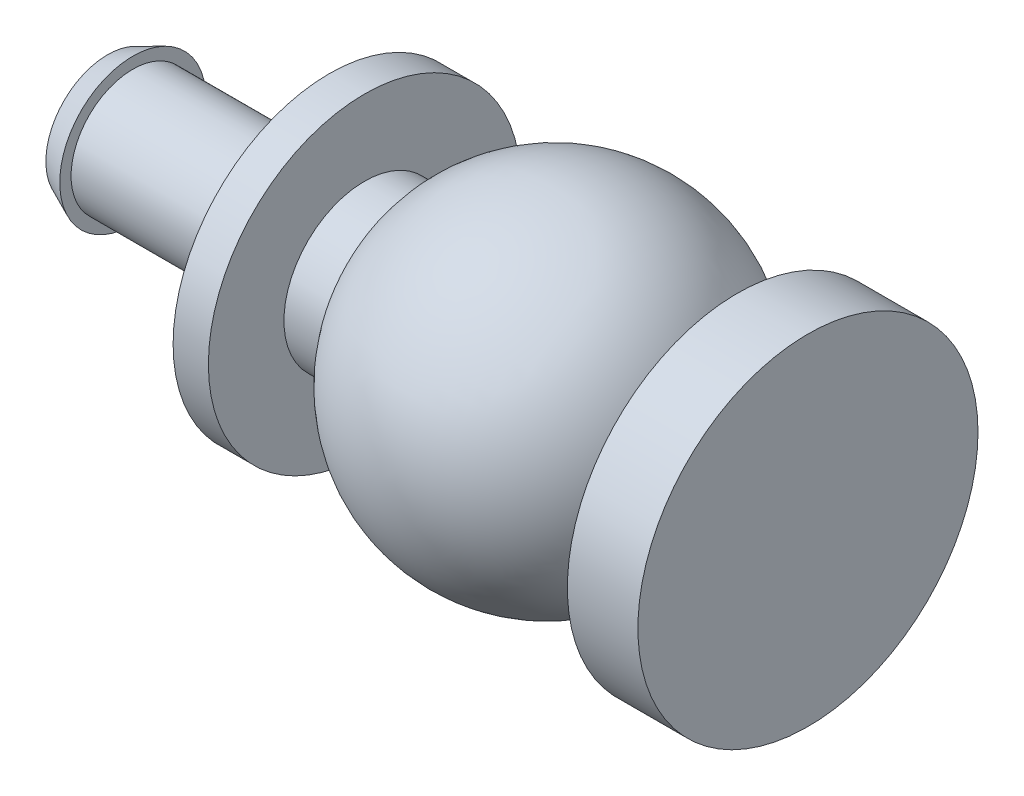
ISO-10303-21;
HEADER;
FILE_DESCRIPTION(('STEP AP214'),'2;1');
FILE_NAME('part.step','',(''),(''),'','','');
FILE_SCHEMA(('AUTOMOTIVE_DESIGN { 1 0 10303 214 1 1 1 1 }'));
ENDSEC;
DATA;
#1=APPLICATION_CONTEXT('core data for automotive mechanical design processes');
#2=APPLICATION_PROTOCOL_DEFINITION('international standard','automotive_design',2000,#1);
#3=PRODUCT_CONTEXT('',#1,'mechanical');
#4=PRODUCT('Part','Part','',(#3));
#5=PRODUCT_RELATED_PRODUCT_CATEGORY('part','',(#4));
#6=PRODUCT_DEFINITION_FORMATION('','',#4);
#7=PRODUCT_DEFINITION_CONTEXT('part definition',#1,'design');
#8=PRODUCT_DEFINITION('design','',#6,#7);
#9=PRODUCT_DEFINITION_SHAPE('','',#8);
#10=(LENGTH_UNIT() NAMED_UNIT(*) SI_UNIT(.MILLI.,.METRE.));
#11=(NAMED_UNIT(*) PLANE_ANGLE_UNIT() SI_UNIT($,.RADIAN.));
#12=(NAMED_UNIT(*) SI_UNIT($,.STERADIAN.) SOLID_ANGLE_UNIT());
#13=UNCERTAINTY_MEASURE_WITH_UNIT(LENGTH_MEASURE(1.E-05),#10,'distance_accuracy_value','');
#14=(GEOMETRIC_REPRESENTATION_CONTEXT(3) GLOBAL_UNCERTAINTY_ASSIGNED_CONTEXT((#13)) GLOBAL_UNIT_ASSIGNED_CONTEXT((#10,
#11,#12)) REPRESENTATION_CONTEXT('',''));
#15=CARTESIAN_POINT('',(0.,0.,0.));
#16=DIRECTION('',(0.,0.,1.));
#17=DIRECTION('',(1.,0.,0.));
#18=AXIS2_PLACEMENT_3D('',#15,#16,#17);
#19=CARTESIAN_POINT('',(0.,0.,0.));
#20=DIRECTION('',(1.,0.,0.));
#21=DIRECTION('',(0.,0.,-1.));
#22=AXIS2_PLACEMENT_3D('',#19,#20,#21);
#23=PLANE('',#22);
#24=CARTESIAN_POINT('',(0.,0.,0.));
#25=DIRECTION('',(-1.,0.,0.));
#26=DIRECTION('',(0.,0.,1.));
#27=AXIS2_PLACEMENT_3D('',#24,#25,#26);
#28=CIRCLE('',#27,1.25);
#29=CARTESIAN_POINT('',(0.,0.,1.25));
#30=VERTEX_POINT('',#29);
#31=EDGE_CURVE('E75',#30,#30,#28,.T.);
#32=ORIENTED_EDGE('',*,*,#31,.F.);
#33=EDGE_LOOP('',(#32));
#34=FACE_BOUND('',#33,.T.);
#35=CARTESIAN_POINT('',(0.,0.,0.));
#36=DIRECTION('',(1.,0.,0.));
#37=DIRECTION('',(0.,0.,-1.));
#38=AXIS2_PLACEMENT_3D('',#35,#36,#37);
#39=CIRCLE('',#38,2.45);
#40=CARTESIAN_POINT('',(0.,0.,-2.45));
#41=VERTEX_POINT('',#40);
#42=EDGE_CURVE('E10',#41,#41,#39,.T.);
#43=ORIENTED_EDGE('',*,*,#42,.F.);
#44=EDGE_LOOP('',(#43));
#45=FACE_BOUND('',#44,.T.);
#46=ADVANCED_FACE('F31',(#34,#45),#23,.F.);
#47=CARTESIAN_POINT('',(0.,0.,0.));
#48=DIRECTION('',(1.,0.,0.));
#49=DIRECTION('',(0.,0.,-1.));
#50=AXIS2_PLACEMENT_3D('',#47,#48,#49);
#51=CONICAL_SURFACE('',#50,2.45,0.422853926132942);
#52=CARTESIAN_POINT('',(1.,0.,0.));
#53=DIRECTION('',(1.,0.,0.));
#54=DIRECTION('',(0.,0.,-1.));
#55=AXIS2_PLACEMENT_3D('',#52,#53,#54);
#56=CIRCLE('',#55,2.9);
#57=CARTESIAN_POINT('',(1.,0.,-2.9));
#58=VERTEX_POINT('',#57);
#59=EDGE_CURVE('E37',#58,#58,#56,.T.);
#60=ORIENTED_EDGE('',*,*,#59,.F.);
#61=EDGE_LOOP('',(#60));
#62=FACE_BOUND('',#61,.T.);
#63=ORIENTED_EDGE('',*,*,#42,.T.);
#64=EDGE_LOOP('',(#63));
#65=FACE_BOUND('',#64,.T.);
#66=ADVANCED_FACE('F92',(#62,#65),#51,.T.);
#67=CARTESIAN_POINT('',(1.,0.,2.9));
#68=DIRECTION('',(-1.,0.,0.));
#69=DIRECTION('',(0.,0.,1.));
#70=AXIS2_PLACEMENT_3D('',#67,#68,#69);
#71=PLANE('',#70);
#72=CARTESIAN_POINT('',(1.,0.,0.));
#73=DIRECTION('',(1.,0.,0.));
#74=DIRECTION('',(0.,0.,-1.));
#75=AXIS2_PLACEMENT_3D('',#72,#73,#74);
#76=CIRCLE('',#75,2.45);
#77=CARTESIAN_POINT('',(1.,0.,-2.45));
#78=VERTEX_POINT('',#77);
#79=EDGE_CURVE('E41',#78,#78,#76,.T.);
#80=ORIENTED_EDGE('',*,*,#79,.F.);
#81=EDGE_LOOP('',(#80));
#82=FACE_BOUND('',#81,.T.);
#83=ORIENTED_EDGE('',*,*,#59,.T.);
#84=EDGE_LOOP('',(#83));
#85=FACE_BOUND('',#84,.T.);
#86=ADVANCED_FACE('F96',(#82,#85),#71,.F.);
#87=CARTESIAN_POINT('',(27.8,0.,0.));
#88=DIRECTION('',(1.,0.,0.));
#89=DIRECTION('',(0.,0.,-1.));
#90=AXIS2_PLACEMENT_3D('',#87,#88,#89);
#91=CYLINDRICAL_SURFACE('',#90,2.45);
#92=CARTESIAN_POINT('',(6.8,0.,0.));
#93=DIRECTION('',(1.,0.,0.));
#94=DIRECTION('',(0.,0.,-1.));
#95=AXIS2_PLACEMENT_3D('',#92,#93,#94);
#96=CIRCLE('',#95,2.45);
#97=CARTESIAN_POINT('',(6.8,0.,-2.45));
#98=VERTEX_POINT('',#97);
#99=EDGE_CURVE('E45',#98,#98,#96,.T.);
#100=ORIENTED_EDGE('',*,*,#99,.F.);
#101=EDGE_LOOP('',(#100));
#102=FACE_BOUND('',#101,.T.);
#103=ORIENTED_EDGE('',*,*,#79,.T.);
#104=EDGE_LOOP('',(#103));
#105=FACE_BOUND('',#104,.T.);
#106=ADVANCED_FACE('F101',(#102,#105),#91,.T.);
#107=CARTESIAN_POINT('',(6.8,0.,0.));
#108=DIRECTION('',(1.,0.,0.));
#109=DIRECTION('',(0.,0.,-1.));
#110=AXIS2_PLACEMENT_3D('',#107,#108,#109);
#111=CONICAL_SURFACE('',#110,2.45,1.08083900054117);
#112=CARTESIAN_POINT('',(8.8,0.,0.));
#113=DIRECTION('',(1.,0.,0.));
#114=DIRECTION('',(0.,0.,-1.));
#115=AXIS2_PLACEMENT_3D('',#112,#113,#114);
#116=CIRCLE('',#115,6.2);
#117=CARTESIAN_POINT('',(8.8,0.,-6.2));
#118=VERTEX_POINT('',#117);
#119=EDGE_CURVE('E50',#118,#118,#116,.T.);
#120=ORIENTED_EDGE('',*,*,#119,.F.);
#121=EDGE_LOOP('',(#120));
#122=FACE_BOUND('',#121,.T.);
#123=ORIENTED_EDGE('',*,*,#99,.T.);
#124=EDGE_LOOP('',(#123));
#125=FACE_BOUND('',#124,.T.);
#126=ADVANCED_FACE('F107',(#122,#125),#111,.T.);
#127=CARTESIAN_POINT('',(27.8,0.,0.));
#128=DIRECTION('',(1.,0.,0.));
#129=DIRECTION('',(0.,0.,-1.));
#130=AXIS2_PLACEMENT_3D('',#127,#128,#129);
#131=CYLINDRICAL_SURFACE('',#130,6.2);
#132=CARTESIAN_POINT('',(10.2,0.,0.));
#133=DIRECTION('',(1.,0.,0.));
#134=DIRECTION('',(0.,0.,-1.));
#135=AXIS2_PLACEMENT_3D('',#132,#133,#134);
#136=CIRCLE('',#135,6.2);
#137=CARTESIAN_POINT('',(10.2,0.,-6.2));
#138=VERTEX_POINT('',#137);
#139=EDGE_CURVE('E53',#138,#138,#136,.T.);
#140=ORIENTED_EDGE('',*,*,#139,.F.);
#141=EDGE_LOOP('',(#140));
#142=FACE_BOUND('',#141,.T.);
#143=ORIENTED_EDGE('',*,*,#119,.T.);
#144=EDGE_LOOP('',(#143));
#145=FACE_BOUND('',#144,.T.);
#146=ADVANCED_FACE('F111',(#142,#145),#131,.T.);
#147=CARTESIAN_POINT('',(10.2,0.,6.2));
#148=DIRECTION('',(-1.,0.,0.));
#149=DIRECTION('',(0.,0.,1.));
#150=AXIS2_PLACEMENT_3D('',#147,#148,#149);
#151=PLANE('',#150);
#152=CARTESIAN_POINT('',(10.2,0.,0.));
#153=DIRECTION('',(1.,0.,0.));
#154=DIRECTION('',(0.,0.,-1.));
#155=AXIS2_PLACEMENT_3D('',#152,#153,#154);
#156=CIRCLE('',#155,3.2);
#157=CARTESIAN_POINT('',(10.2,0.,-3.2));
#158=VERTEX_POINT('',#157);
#159=EDGE_CURVE('E56',#158,#158,#156,.T.);
#160=ORIENTED_EDGE('',*,*,#159,.F.);
#161=EDGE_LOOP('',(#160));
#162=FACE_BOUND('',#161,.T.);
#163=ORIENTED_EDGE('',*,*,#139,.T.);
#164=EDGE_LOOP('',(#163));
#165=FACE_BOUND('',#164,.T.);
#166=ADVANCED_FACE('F115',(#162,#165),#151,.F.);
#167=CARTESIAN_POINT('',(27.8,0.,0.));
#168=DIRECTION('',(1.,0.,0.));
#169=DIRECTION('',(0.,0.,-1.));
#170=AXIS2_PLACEMENT_3D('',#167,#168,#169);
#171=CYLINDRICAL_SURFACE('',#170,3.2);
#172=CARTESIAN_POINT('',(11.85,0.,0.));
#173=DIRECTION('',(1.,0.,0.));
#174=DIRECTION('',(0.,0.,-1.));
#175=AXIS2_PLACEMENT_3D('',#172,#173,#174);
#176=CIRCLE('',#175,3.2);
#177=CARTESIAN_POINT('',(11.85,0.,-3.2));
#178=VERTEX_POINT('',#177);
#179=EDGE_CURVE('E59',#178,#178,#176,.T.);
#180=ORIENTED_EDGE('',*,*,#179,.F.);
#181=EDGE_LOOP('',(#180));
#182=FACE_BOUND('',#181,.T.);
#183=ORIENTED_EDGE('',*,*,#159,.T.);
#184=EDGE_LOOP('',(#183));
#185=FACE_BOUND('',#184,.T.);
#186=ADVANCED_FACE('F119',(#182,#185),#171,.T.);
#187=CARTESIAN_POINT('',(17.6,0.,0.));
#188=DIRECTION('',(1.,0.,0.));
#189=DIRECTION('',(0.,0.,-1.));
#190=AXIS2_PLACEMENT_3D('',#187,#188,#189);
#191=DEGENERATE_TOROIDAL_SURFACE('',#190,0.318309859154926,6.43169014084507,.T.);
#192=CARTESIAN_POINT('',(23.35,0.,0.));
#193=DIRECTION('',(1.,0.,0.));
#194=DIRECTION('',(0.,0.,-1.));
#195=AXIS2_PLACEMENT_3D('',#192,#193,#194);
#196=CIRCLE('',#195,3.2);
#197=CARTESIAN_POINT('',(23.35,0.,-3.2));
#198=VERTEX_POINT('',#197);
#199=EDGE_CURVE('E62',#198,#198,#196,.T.);
#200=ORIENTED_EDGE('',*,*,#199,.F.);
#201=EDGE_LOOP('',(#200));
#202=FACE_BOUND('',#201,.T.);
#203=ORIENTED_EDGE('',*,*,#179,.T.);
#204=EDGE_LOOP('',(#203));
#205=FACE_BOUND('',#204,.T.);
#206=ADVANCED_FACE('F123',(#202,#205),#191,.T.);
#207=CARTESIAN_POINT('',(27.8,0.,0.));
#208=DIRECTION('',(1.,0.,0.));
#209=DIRECTION('',(0.,0.,-1.));
#210=AXIS2_PLACEMENT_3D('',#207,#208,#209);
#211=CYLINDRICAL_SURFACE('',#210,3.2);
#212=CARTESIAN_POINT('',(25.,0.,0.));
#213=DIRECTION('',(1.,0.,0.));
#214=DIRECTION('',(0.,0.,-1.));
#215=AXIS2_PLACEMENT_3D('',#212,#213,#214);
#216=CIRCLE('',#215,3.2);
#217=CARTESIAN_POINT('',(25.,0.,-3.2));
#218=VERTEX_POINT('',#217);
#219=EDGE_CURVE('E65',#218,#218,#216,.T.);
#220=ORIENTED_EDGE('',*,*,#219,.F.);
#221=EDGE_LOOP('',(#220));
#222=FACE_BOUND('',#221,.T.);
#223=ORIENTED_EDGE('',*,*,#199,.T.);
#224=EDGE_LOOP('',(#223));
#225=FACE_BOUND('',#224,.T.);
#226=ADVANCED_FACE('F127',(#222,#225),#211,.T.);
#227=CARTESIAN_POINT('',(25.,0.,3.2));
#228=DIRECTION('',(1.,0.,0.));
#229=DIRECTION('',(0.,0.,-1.));
#230=AXIS2_PLACEMENT_3D('',#227,#228,#229);
#231=PLANE('',#230);
#232=CARTESIAN_POINT('',(25.,0.,0.));
#233=DIRECTION('',(1.,0.,0.));
#234=DIRECTION('',(0.,0.,-1.));
#235=AXIS2_PLACEMENT_3D('',#232,#233,#234);
#236=CIRCLE('',#235,6.75);
#237=CARTESIAN_POINT('',(25.,0.,-6.75));
#238=VERTEX_POINT('',#237);
#239=EDGE_CURVE('E68',#238,#238,#236,.T.);
#240=ORIENTED_EDGE('',*,*,#239,.F.);
#241=EDGE_LOOP('',(#240));
#242=FACE_BOUND('',#241,.T.);
#243=ORIENTED_EDGE('',*,*,#219,.T.);
#244=EDGE_LOOP('',(#243));
#245=FACE_BOUND('',#244,.T.);
#246=ADVANCED_FACE('F131',(#242,#245),#231,.F.);
#247=CARTESIAN_POINT('',(27.8,0.,0.));
#248=DIRECTION('',(1.,0.,0.));
#249=DIRECTION('',(0.,0.,-1.));
#250=AXIS2_PLACEMENT_3D('',#247,#248,#249);
#251=CYLINDRICAL_SURFACE('',#250,6.75);
#252=CARTESIAN_POINT('',(27.8,0.,0.));
#253=DIRECTION('',(1.,0.,0.));
#254=DIRECTION('',(0.,0.,-1.));
#255=AXIS2_PLACEMENT_3D('',#252,#253,#254);
#256=CIRCLE('',#255,6.75);
#257=CARTESIAN_POINT('',(27.8,0.,-6.75));
#258=VERTEX_POINT('',#257);
#259=EDGE_CURVE('E71',#258,#258,#256,.T.);
#260=ORIENTED_EDGE('',*,*,#259,.F.);
#261=EDGE_LOOP('',(#260));
#262=FACE_BOUND('',#261,.T.);
#263=ORIENTED_EDGE('',*,*,#239,.T.);
#264=EDGE_LOOP('',(#263));
#265=FACE_BOUND('',#264,.T.);
#266=ADVANCED_FACE('F135',(#262,#265),#251,.T.);
#267=CARTESIAN_POINT('',(27.8,0.,6.75));
#268=DIRECTION('',(-1.,0.,0.));
#269=DIRECTION('',(0.,0.,1.));
#270=AXIS2_PLACEMENT_3D('',#267,#268,#269);
#271=PLANE('',#270);
#272=ORIENTED_EDGE('',*,*,#259,.T.);
#273=EDGE_LOOP('',(#272));
#274=FACE_BOUND('',#273,.T.);
#275=ADVANCED_FACE('F86',(#274),#271,.F.);
#276=CARTESIAN_POINT('',(4.,0.,0.));
#277=DIRECTION('',(-1.,0.,0.));
#278=DIRECTION('',(0.,0.,1.));
#279=AXIS2_PLACEMENT_3D('',#276,#277,#278);
#280=CYLINDRICAL_SURFACE('',#279,1.25);
#281=CARTESIAN_POINT('',(4.,0.,0.));
#282=DIRECTION('',(-1.,0.,0.));
#283=DIRECTION('',(0.,0.,1.));
#284=AXIS2_PLACEMENT_3D('',#281,#282,#283);
#285=CIRCLE('',#284,1.25);
#286=CARTESIAN_POINT('',(4.,0.,1.25));
#287=VERTEX_POINT('',#286);
#288=EDGE_CURVE('E74',#287,#287,#285,.T.);
#289=ORIENTED_EDGE('',*,*,#288,.F.);
#290=EDGE_LOOP('',(#289));
#291=FACE_BOUND('',#290,.T.);
#292=ORIENTED_EDGE('',*,*,#31,.T.);
#293=EDGE_LOOP('',(#292));
#294=FACE_BOUND('',#293,.T.);
#295=ADVANCED_FACE('F83',(#291,#294),#280,.F.);
#296=CARTESIAN_POINT('',(4.,0.,0.));
#297=DIRECTION('',(-1.,0.,0.));
#298=DIRECTION('',(0.,0.,1.));
#299=AXIS2_PLACEMENT_3D('',#296,#297,#298);
#300=PLANE('',#299);
#301=ORIENTED_EDGE('',*,*,#288,.T.);
#302=EDGE_LOOP('',(#301));
#303=FACE_BOUND('',#302,.T.);
#304=ADVANCED_FACE('F81',(#303),#300,.T.);
#305=CLOSED_SHELL('',(#46,#66,#86,#106,#126,#146,#166,#186,#206,#226,#246,#266,#275,#295,#304));
#306=MANIFOLD_SOLID_BREP('B2',#305);
#307=ADVANCED_BREP_SHAPE_REPRESENTATION('',(#18,#306),#14);
#308=SHAPE_DEFINITION_REPRESENTATION(#9,#307);
ENDSEC;
END-ISO-10303-21;
